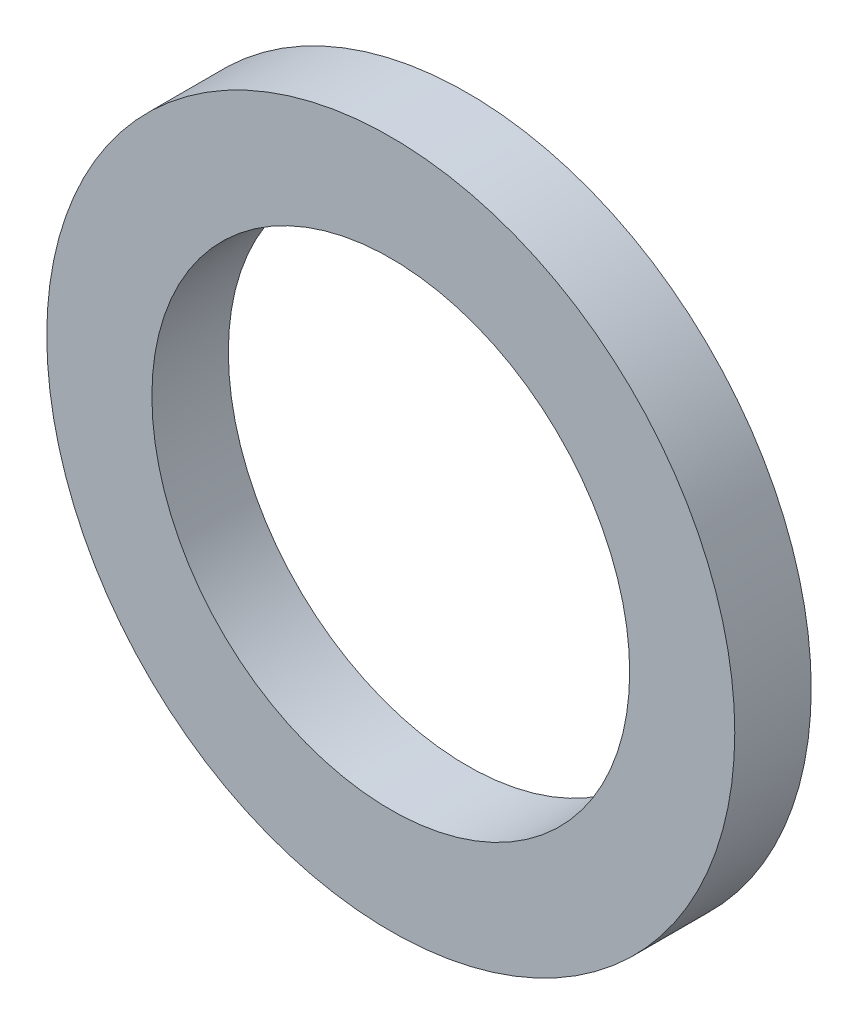
ISO-10303-21;
HEADER;
FILE_DESCRIPTION(('STEP AP214'),'2;1');
FILE_NAME('part.step','',(''),(''),'','','');
FILE_SCHEMA(('AUTOMOTIVE_DESIGN { 1 0 10303 214 1 1 1 1 }'));
ENDSEC;
DATA;
#1=APPLICATION_CONTEXT('core data for automotive mechanical design processes');
#2=APPLICATION_PROTOCOL_DEFINITION('international standard','automotive_design',2000,#1);
#3=PRODUCT_CONTEXT('',#1,'mechanical');
#4=PRODUCT('Part','Part','',(#3));
#5=PRODUCT_RELATED_PRODUCT_CATEGORY('part','',(#4));
#6=PRODUCT_DEFINITION_FORMATION('','',#4);
#7=PRODUCT_DEFINITION_CONTEXT('part definition',#1,'design');
#8=PRODUCT_DEFINITION('design','',#6,#7);
#9=PRODUCT_DEFINITION_SHAPE('','',#8);
#10=(LENGTH_UNIT() NAMED_UNIT(*) SI_UNIT(.MILLI.,.METRE.));
#11=(NAMED_UNIT(*) PLANE_ANGLE_UNIT() SI_UNIT($,.RADIAN.));
#12=(NAMED_UNIT(*) SI_UNIT($,.STERADIAN.) SOLID_ANGLE_UNIT());
#13=UNCERTAINTY_MEASURE_WITH_UNIT(LENGTH_MEASURE(1.E-05),#10,'distance_accuracy_value','');
#14=(GEOMETRIC_REPRESENTATION_CONTEXT(3) GLOBAL_UNCERTAINTY_ASSIGNED_CONTEXT((#13)) GLOBAL_UNIT_ASSIGNED_CONTEXT((#10,
#11,#12)) REPRESENTATION_CONTEXT('',''));
#15=CARTESIAN_POINT('',(0.,0.,0.));
#16=DIRECTION('',(0.,0.,1.));
#17=DIRECTION('',(1.,0.,0.));
#18=AXIS2_PLACEMENT_3D('',#15,#16,#17);
#19=CARTESIAN_POINT('',(0.,0.,8.));
#20=DIRECTION('',(0.,0.,1.));
#21=DIRECTION('',(1.,0.,0.));
#22=AXIS2_PLACEMENT_3D('',#19,#20,#21);
#23=PLANE('',#22);
#24=CARTESIAN_POINT('',(0.,0.,8.));
#25=DIRECTION('',(0.,0.,1.));
#26=DIRECTION('',(1.,0.,0.));
#27=AXIS2_PLACEMENT_3D('',#24,#25,#26);
#28=CIRCLE('',#27,36.);
#29=CARTESIAN_POINT('',(36.,0.,8.));
#30=VERTEX_POINT('',#29);
#31=EDGE_CURVE('E10',#30,#30,#28,.T.);
#32=ORIENTED_EDGE('',*,*,#31,.T.);
#33=EDGE_LOOP('',(#32));
#34=FACE_BOUND('',#33,.T.);
#35=CARTESIAN_POINT('',(0.,0.,8.));
#36=DIRECTION('',(0.,0.,1.));
#37=DIRECTION('',(1.,0.,0.));
#38=AXIS2_PLACEMENT_3D('',#35,#36,#37);
#39=CIRCLE('',#38,25.);
#40=CARTESIAN_POINT('',(25.,0.,8.));
#41=VERTEX_POINT('',#40);
#42=EDGE_CURVE('E48',#41,#41,#39,.T.);
#43=ORIENTED_EDGE('',*,*,#42,.F.);
#44=EDGE_LOOP('',(#43));
#45=FACE_BOUND('',#44,.T.);
#46=ADVANCED_FACE('F37',(#34,#45),#23,.T.);
#47=CARTESIAN_POINT('',(0.,0.,0.));
#48=DIRECTION('',(0.,0.,1.));
#49=DIRECTION('',(1.,0.,0.));
#50=AXIS2_PLACEMENT_3D('',#47,#48,#49);
#51=PLANE('',#50);
#52=CARTESIAN_POINT('',(0.,0.,0.));
#53=DIRECTION('',(0.,0.,1.));
#54=DIRECTION('',(1.,0.,0.));
#55=AXIS2_PLACEMENT_3D('',#52,#53,#54);
#56=CIRCLE('',#55,36.);
#57=CARTESIAN_POINT('',(36.,0.,0.));
#58=VERTEX_POINT('',#57);
#59=EDGE_CURVE('E41',#58,#58,#56,.T.);
#60=ORIENTED_EDGE('',*,*,#59,.F.);
#61=EDGE_LOOP('',(#60));
#62=FACE_BOUND('',#61,.T.);
#63=CARTESIAN_POINT('',(0.,0.,0.));
#64=DIRECTION('',(0.,0.,1.));
#65=DIRECTION('',(1.,0.,0.));
#66=AXIS2_PLACEMENT_3D('',#63,#64,#65);
#67=CIRCLE('',#66,25.);
#68=CARTESIAN_POINT('',(25.,0.,0.));
#69=VERTEX_POINT('',#68);
#70=EDGE_CURVE('E50',#69,#69,#67,.T.);
#71=ORIENTED_EDGE('',*,*,#70,.T.);
#72=EDGE_LOOP('',(#71));
#73=FACE_BOUND('',#72,.T.);
#74=ADVANCED_FACE('F60',(#62,#73),#51,.F.);
#75=CARTESIAN_POINT('',(0.,0.,8.));
#76=DIRECTION('',(0.,0.,-1.));
#77=DIRECTION('',(-1.,0.,0.));
#78=AXIS2_PLACEMENT_3D('',#75,#76,#77);
#79=CYLINDRICAL_SURFACE('',#78,36.);
#80=ORIENTED_EDGE('',*,*,#31,.F.);
#81=EDGE_LOOP('',(#80));
#82=FACE_BOUND('',#81,.T.);
#83=ORIENTED_EDGE('',*,*,#59,.T.);
#84=EDGE_LOOP('',(#83));
#85=FACE_BOUND('',#84,.T.);
#86=ADVANCED_FACE('F39',(#82,#85),#79,.T.);
#87=CARTESIAN_POINT('',(0.,0.,8.));
#88=DIRECTION('',(0.,0.,-1.));
#89=DIRECTION('',(-1.,0.,0.));
#90=AXIS2_PLACEMENT_3D('',#87,#88,#89);
#91=CYLINDRICAL_SURFACE('',#90,25.);
#92=ORIENTED_EDGE('',*,*,#42,.T.);
#93=EDGE_LOOP('',(#92));
#94=FACE_BOUND('',#93,.T.);
#95=ORIENTED_EDGE('',*,*,#70,.F.);
#96=EDGE_LOOP('',(#95));
#97=FACE_BOUND('',#96,.T.);
#98=ADVANCED_FACE('F56',(#94,#97),#91,.F.);
#99=CLOSED_SHELL('',(#46,#74,#86,#98));
#100=MANIFOLD_SOLID_BREP('B2',#99);
#101=ADVANCED_BREP_SHAPE_REPRESENTATION('',(#18,#100),#14);
#102=SHAPE_DEFINITION_REPRESENTATION(#9,#101);
ENDSEC;
END-ISO-10303-21;
